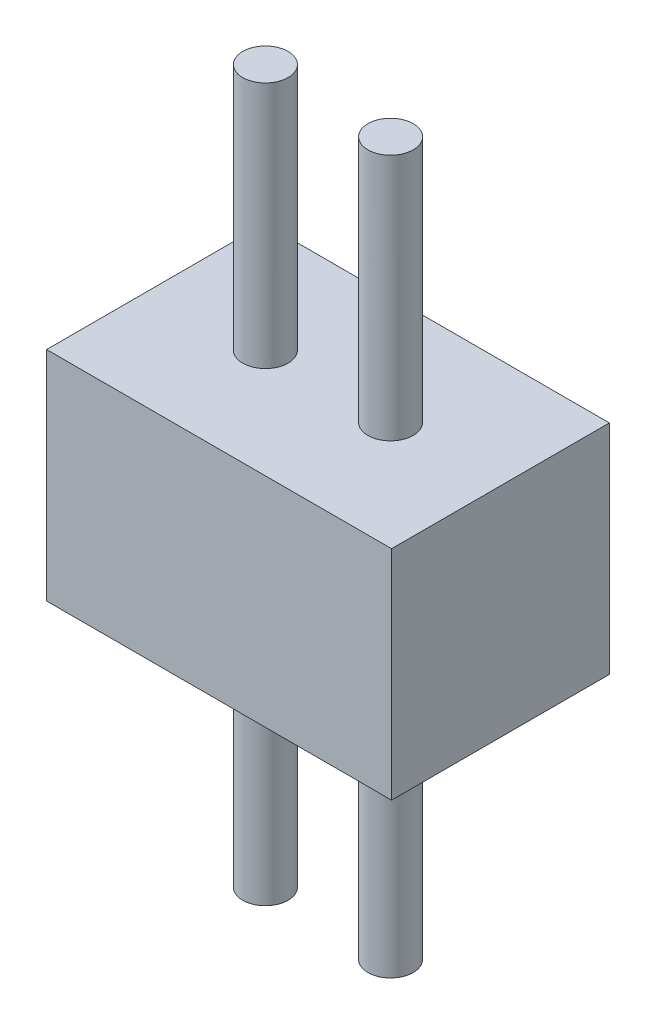
ISO-10303-21;
HEADER;
FILE_DESCRIPTION(('STEP AP214'),'2;1');
FILE_NAME('part.step','',(''),(''),'','','');
FILE_SCHEMA(('AUTOMOTIVE_DESIGN { 1 0 10303 214 1 1 1 1 }'));
ENDSEC;
DATA;
#1=APPLICATION_CONTEXT('core data for automotive mechanical design processes');
#2=APPLICATION_PROTOCOL_DEFINITION('international standard','automotive_design',2000,#1);
#3=PRODUCT_CONTEXT('',#1,'mechanical');
#4=PRODUCT('Part','Part','',(#3));
#5=PRODUCT_RELATED_PRODUCT_CATEGORY('part','',(#4));
#6=PRODUCT_DEFINITION_FORMATION('','',#4);
#7=PRODUCT_DEFINITION_CONTEXT('part definition',#1,'design');
#8=PRODUCT_DEFINITION('design','',#6,#7);
#9=PRODUCT_DEFINITION_SHAPE('','',#8);
#10=(LENGTH_UNIT() NAMED_UNIT(*) SI_UNIT(.MILLI.,.METRE.));
#11=(NAMED_UNIT(*) PLANE_ANGLE_UNIT() SI_UNIT($,.RADIAN.));
#12=(NAMED_UNIT(*) SI_UNIT($,.STERADIAN.) SOLID_ANGLE_UNIT());
#13=UNCERTAINTY_MEASURE_WITH_UNIT(LENGTH_MEASURE(1.E-05),#10,'distance_accuracy_value','');
#14=(GEOMETRIC_REPRESENTATION_CONTEXT(3) GLOBAL_UNCERTAINTY_ASSIGNED_CONTEXT((#13)) GLOBAL_UNIT_ASSIGNED_CONTEXT((#10,
#11,#12)) REPRESENTATION_CONTEXT('',''));
#15=CARTESIAN_POINT('',(0.,0.,0.));
#16=DIRECTION('',(0.,0.,1.));
#17=DIRECTION('',(1.,0.,0.));
#18=AXIS2_PLACEMENT_3D('',#15,#16,#17);
#19=CARTESIAN_POINT('',(0.,2.21,0.));
#20=DIRECTION('',(1.,0.,0.));
#21=DIRECTION('',(0.,0.,-1.));
#22=AXIS2_PLACEMENT_3D('',#19,#20,#21);
#23=PLANE('',#22);
#24=DIRECTION('',(0.,0.,1.));
#25=VECTOR('',#24,1.);
#26=CARTESIAN_POINT('',(0.,0.,0.));
#27=LINE('',#26,#25);
#28=CARTESIAN_POINT('',(0.,0.,-2.21));
#29=VERTEX_POINT('',#28);
#30=CARTESIAN_POINT('',(0.,0.,0.));
#31=VERTEX_POINT('',#30);
#32=EDGE_CURVE('E100',#29,#31,#27,.T.);
#33=ORIENTED_EDGE('',*,*,#32,.T.);
#34=DIRECTION('',(0.,-1.,0.));
#35=VECTOR('',#34,1.);
#36=CARTESIAN_POINT('',(0.,2.21,0.));
#37=LINE('',#36,#35);
#38=CARTESIAN_POINT('',(0.,2.21,0.));
#39=VERTEX_POINT('',#38);
#40=EDGE_CURVE('E91',#39,#31,#37,.T.);
#41=ORIENTED_EDGE('',*,*,#40,.F.);
#42=DIRECTION('',(0.,0.,1.));
#43=VECTOR('',#42,1.);
#44=CARTESIAN_POINT('',(0.,2.21,0.));
#45=LINE('',#44,#43);
#46=CARTESIAN_POINT('',(0.,2.21,-2.21));
#47=VERTEX_POINT('',#46);
#48=EDGE_CURVE('E85',#47,#39,#45,.T.);
#49=ORIENTED_EDGE('',*,*,#48,.F.);
#50=DIRECTION('',(0.,-1.,0.));
#51=VECTOR('',#50,1.);
#52=CARTESIAN_POINT('',(0.,2.21,-2.21));
#53=LINE('',#52,#51);
#54=EDGE_CURVE('E96',#47,#29,#53,.T.);
#55=ORIENTED_EDGE('',*,*,#54,.T.);
#56=EDGE_LOOP('',(#33,#41,#49,#55));
#57=FACE_BOUND('',#56,.T.);
#58=ADVANCED_FACE('F33',(#57),#23,.F.);
#59=CARTESIAN_POINT('',(0.,2.21,0.));
#60=DIRECTION('',(0.,0.,-1.));
#61=DIRECTION('',(-1.,0.,0.));
#62=AXIS2_PLACEMENT_3D('',#59,#60,#61);
#63=PLANE('',#62);
#64=DIRECTION('',(1.,0.,0.));
#65=VECTOR('',#64,1.);
#66=CARTESIAN_POINT('',(0.,0.,0.));
#67=LINE('',#66,#65);
#68=CARTESIAN_POINT('',(3.5,0.,0.));
#69=VERTEX_POINT('',#68);
#70=EDGE_CURVE('E90',#31,#69,#67,.T.);
#71=ORIENTED_EDGE('',*,*,#70,.T.);
#72=DIRECTION('',(0.,-1.,0.));
#73=VECTOR('',#72,1.);
#74=CARTESIAN_POINT('',(3.5,2.21,0.));
#75=LINE('',#74,#73);
#76=CARTESIAN_POINT('',(3.5,2.21,0.));
#77=VERTEX_POINT('',#76);
#78=EDGE_CURVE('E88',#77,#69,#75,.T.);
#79=ORIENTED_EDGE('',*,*,#78,.F.);
#80=DIRECTION('',(1.,0.,0.));
#81=VECTOR('',#80,1.);
#82=CARTESIAN_POINT('',(0.,2.21,0.));
#83=LINE('',#82,#81);
#84=EDGE_CURVE('E80',#39,#77,#83,.T.);
#85=ORIENTED_EDGE('',*,*,#84,.F.);
#86=ORIENTED_EDGE('',*,*,#40,.T.);
#87=EDGE_LOOP('',(#71,#79,#85,#86));
#88=FACE_BOUND('',#87,.T.);
#89=ADVANCED_FACE('F89',(#88),#63,.F.);
#90=CARTESIAN_POINT('',(3.5,2.21,0.));
#91=DIRECTION('',(-1.,0.,0.));
#92=DIRECTION('',(0.,0.,1.));
#93=AXIS2_PLACEMENT_3D('',#90,#91,#92);
#94=PLANE('',#93);
#95=DIRECTION('',(0.,0.,-1.));
#96=VECTOR('',#95,1.);
#97=CARTESIAN_POINT('',(3.5,0.,0.));
#98=LINE('',#97,#96);
#99=CARTESIAN_POINT('',(3.5,0.,-2.21));
#100=VERTEX_POINT('',#99);
#101=EDGE_CURVE('E66',#69,#100,#98,.T.);
#102=ORIENTED_EDGE('',*,*,#101,.T.);
#103=DIRECTION('',(0.,-1.,0.));
#104=VECTOR('',#103,1.);
#105=CARTESIAN_POINT('',(3.5,2.21,-2.21));
#106=LINE('',#105,#104);
#107=CARTESIAN_POINT('',(3.5,2.21,-2.21));
#108=VERTEX_POINT('',#107);
#109=EDGE_CURVE('E92',#108,#100,#106,.T.);
#110=ORIENTED_EDGE('',*,*,#109,.F.);
#111=DIRECTION('',(0.,0.,-1.));
#112=VECTOR('',#111,1.);
#113=CARTESIAN_POINT('',(3.5,2.21,0.));
#114=LINE('',#113,#112);
#115=EDGE_CURVE('E83',#77,#108,#114,.T.);
#116=ORIENTED_EDGE('',*,*,#115,.F.);
#117=ORIENTED_EDGE('',*,*,#78,.T.);
#118=EDGE_LOOP('',(#102,#110,#116,#117));
#119=FACE_BOUND('',#118,.T.);
#120=ADVANCED_FACE('F94',(#119),#94,.F.);
#121=CARTESIAN_POINT('',(0.,2.21,-2.21));
#122=DIRECTION('',(0.,0.,1.));
#123=DIRECTION('',(1.,0.,0.));
#124=AXIS2_PLACEMENT_3D('',#121,#122,#123);
#125=PLANE('',#124);
#126=DIRECTION('',(-1.,0.,0.));
#127=VECTOR('',#126,1.);
#128=CARTESIAN_POINT('',(0.,0.,-2.21));
#129=LINE('',#128,#127);
#130=EDGE_CURVE('E72',#100,#29,#129,.T.);
#131=ORIENTED_EDGE('',*,*,#130,.T.);
#132=ORIENTED_EDGE('',*,*,#54,.F.);
#133=DIRECTION('',(-1.,0.,0.));
#134=VECTOR('',#133,1.);
#135=CARTESIAN_POINT('',(0.,2.21,-2.21));
#136=LINE('',#135,#134);
#137=EDGE_CURVE('E49',#108,#47,#136,.T.);
#138=ORIENTED_EDGE('',*,*,#137,.F.);
#139=ORIENTED_EDGE('',*,*,#109,.T.);
#140=EDGE_LOOP('',(#131,#132,#138,#139));
#141=FACE_BOUND('',#140,.T.);
#142=ADVANCED_FACE('F116',(#141),#125,.F.);
#143=CARTESIAN_POINT('',(0.,2.21,0.));
#144=DIRECTION('',(0.,-1.,0.));
#145=DIRECTION('',(0.,0.,-1.));
#146=AXIS2_PLACEMENT_3D('',#143,#144,#145);
#147=PLANE('',#146);
#148=CARTESIAN_POINT('',(1.115,2.21,-1.105));
#149=DIRECTION('',(0.,-1.,0.));
#150=DIRECTION('',(0.,0.,-1.));
#151=AXIS2_PLACEMENT_3D('',#148,#149,#150);
#152=CIRCLE('',#151,0.23);
#153=CARTESIAN_POINT('',(1.115,2.21,-1.335));
#154=VERTEX_POINT('',#153);
#155=EDGE_CURVE('E11',#154,#154,#152,.F.);
#156=ORIENTED_EDGE('',*,*,#155,.F.);
#157=EDGE_LOOP('',(#156));
#158=FACE_BOUND('',#157,.T.);
#159=CARTESIAN_POINT('',(2.385,2.21,-1.105));
#160=DIRECTION('',(0.,-1.,0.));
#161=DIRECTION('',(0.,0.,-1.));
#162=AXIS2_PLACEMENT_3D('',#159,#160,#161);
#163=CIRCLE('',#162,0.23);
#164=CARTESIAN_POINT('',(2.385,2.21,-1.335));
#165=VERTEX_POINT('',#164);
#166=EDGE_CURVE('E41',#165,#165,#163,.F.);
#167=ORIENTED_EDGE('',*,*,#166,.F.);
#168=EDGE_LOOP('',(#167));
#169=FACE_BOUND('',#168,.T.);
#170=ORIENTED_EDGE('',*,*,#48,.T.);
#171=ORIENTED_EDGE('',*,*,#84,.T.);
#172=ORIENTED_EDGE('',*,*,#115,.T.);
#173=ORIENTED_EDGE('',*,*,#137,.T.);
#174=EDGE_LOOP('',(#170,#171,#172,#173));
#175=FACE_BOUND('',#174,.T.);
#176=ADVANCED_FACE('F81',(#158,#169,#175),#147,.F.);
#177=CARTESIAN_POINT('',(0.,0.,0.));
#178=DIRECTION('',(0.,-1.,0.));
#179=DIRECTION('',(0.,0.,-1.));
#180=AXIS2_PLACEMENT_3D('',#177,#178,#179);
#181=PLANE('',#180);
#182=CARTESIAN_POINT('',(2.385,0.,-1.105));
#183=DIRECTION('',(0.,-1.,0.));
#184=DIRECTION('',(0.,0.,-1.));
#185=AXIS2_PLACEMENT_3D('',#182,#183,#184);
#186=CIRCLE('',#185,0.23);
#187=CARTESIAN_POINT('',(2.385,0.,-1.335));
#188=VERTEX_POINT('',#187);
#189=EDGE_CURVE('E143',#188,#188,#186,.T.);
#190=ORIENTED_EDGE('',*,*,#189,.F.);
#191=EDGE_LOOP('',(#190));
#192=FACE_BOUND('',#191,.T.);
#193=CARTESIAN_POINT('',(1.115,0.,-1.105));
#194=DIRECTION('',(0.,-1.,0.));
#195=DIRECTION('',(0.,0.,-1.));
#196=AXIS2_PLACEMENT_3D('',#193,#194,#195);
#197=CIRCLE('',#196,0.23);
#198=CARTESIAN_POINT('',(1.115,0.,-1.335));
#199=VERTEX_POINT('',#198);
#200=EDGE_CURVE('E137',#199,#199,#197,.T.);
#201=ORIENTED_EDGE('',*,*,#200,.F.);
#202=EDGE_LOOP('',(#201));
#203=FACE_BOUND('',#202,.T.);
#204=ORIENTED_EDGE('',*,*,#32,.F.);
#205=ORIENTED_EDGE('',*,*,#130,.F.);
#206=ORIENTED_EDGE('',*,*,#101,.F.);
#207=ORIENTED_EDGE('',*,*,#70,.F.);
#208=EDGE_LOOP('',(#204,#205,#206,#207));
#209=FACE_BOUND('',#208,.T.);
#210=ADVANCED_FACE('F115',(#192,#203,#209),#181,.T.);
#211=CARTESIAN_POINT('',(1.115,-2.51,-1.105));
#212=DIRECTION('',(0.,1.,0.));
#213=DIRECTION('',(0.,0.,1.));
#214=AXIS2_PLACEMENT_3D('',#211,#212,#213);
#215=CYLINDRICAL_SURFACE('',#214,0.23);
#216=CARTESIAN_POINT('',(1.115,-2.51,-1.105));
#217=DIRECTION('',(0.,-1.,0.));
#218=DIRECTION('',(0.,0.,-1.));
#219=AXIS2_PLACEMENT_3D('',#216,#217,#218);
#220=CIRCLE('',#219,0.23);
#221=CARTESIAN_POINT('',(1.115,-2.51,-1.335));
#222=VERTEX_POINT('',#221);
#223=EDGE_CURVE('E103',#222,#222,#220,.T.);
#224=ORIENTED_EDGE('',*,*,#223,.F.);
#225=EDGE_LOOP('',(#224));
#226=FACE_BOUND('',#225,.T.);
#227=ORIENTED_EDGE('',*,*,#200,.T.);
#228=EDGE_LOOP('',(#227));
#229=FACE_BOUND('',#228,.T.);
#230=ADVANCED_FACE('F123',(#226,#229),#215,.T.);
#231=CARTESIAN_POINT('',(1.115,-2.51,-1.105));
#232=DIRECTION('',(0.,-1.,0.));
#233=DIRECTION('',(0.,0.,-1.));
#234=AXIS2_PLACEMENT_3D('',#231,#232,#233);
#235=PLANE('',#234);
#236=ORIENTED_EDGE('',*,*,#223,.T.);
#237=EDGE_LOOP('',(#236));
#238=FACE_BOUND('',#237,.T.);
#239=ADVANCED_FACE('F180',(#238),#235,.T.);
#240=CARTESIAN_POINT('',(2.385,-2.51,-1.105));
#241=DIRECTION('',(0.,1.,0.));
#242=DIRECTION('',(0.,0.,1.));
#243=AXIS2_PLACEMENT_3D('',#240,#241,#242);
#244=CYLINDRICAL_SURFACE('',#243,0.23);
#245=CARTESIAN_POINT('',(2.385,-2.51,-1.105));
#246=DIRECTION('',(0.,-1.,0.));
#247=DIRECTION('',(0.,0.,-1.));
#248=AXIS2_PLACEMENT_3D('',#245,#246,#247);
#249=CIRCLE('',#248,0.23);
#250=CARTESIAN_POINT('',(2.385,-2.51,-1.335));
#251=VERTEX_POINT('',#250);
#252=EDGE_CURVE('E140',#251,#251,#249,.T.);
#253=ORIENTED_EDGE('',*,*,#252,.F.);
#254=EDGE_LOOP('',(#253));
#255=FACE_BOUND('',#254,.T.);
#256=ORIENTED_EDGE('',*,*,#189,.T.);
#257=EDGE_LOOP('',(#256));
#258=FACE_BOUND('',#257,.T.);
#259=ADVANCED_FACE('F176',(#255,#258),#244,.T.);
#260=CARTESIAN_POINT('',(2.385,-2.51,-1.105));
#261=DIRECTION('',(0.,-1.,0.));
#262=DIRECTION('',(0.,0.,-1.));
#263=AXIS2_PLACEMENT_3D('',#260,#261,#262);
#264=PLANE('',#263);
#265=ORIENTED_EDGE('',*,*,#252,.T.);
#266=EDGE_LOOP('',(#265));
#267=FACE_BOUND('',#266,.T.);
#268=ADVANCED_FACE('F172',(#267),#264,.T.);
#269=CARTESIAN_POINT('',(2.385,4.72,-1.105));
#270=DIRECTION('',(0.,-1.,0.));
#271=DIRECTION('',(0.,0.,-1.));
#272=AXIS2_PLACEMENT_3D('',#269,#270,#271);
#273=CYLINDRICAL_SURFACE('',#272,0.23);
#274=CARTESIAN_POINT('',(2.385,4.72,-1.105));
#275=DIRECTION('',(0.,1.,0.));
#276=DIRECTION('',(0.,0.,1.));
#277=AXIS2_PLACEMENT_3D('',#274,#275,#276);
#278=CIRCLE('',#277,0.23);
#279=CARTESIAN_POINT('',(2.385,4.72,-0.875));
#280=VERTEX_POINT('',#279);
#281=EDGE_CURVE('E146',#280,#280,#278,.T.);
#282=ORIENTED_EDGE('',*,*,#281,.F.);
#283=EDGE_LOOP('',(#282));
#284=FACE_BOUND('',#283,.T.);
#285=ORIENTED_EDGE('',*,*,#166,.T.);
#286=EDGE_LOOP('',(#285));
#287=FACE_BOUND('',#286,.T.);
#288=ADVANCED_FACE('F112',(#284,#287),#273,.T.);
#289=CARTESIAN_POINT('',(2.385,4.72,-1.105));
#290=DIRECTION('',(0.,1.,0.));
#291=DIRECTION('',(0.,0.,1.));
#292=AXIS2_PLACEMENT_3D('',#289,#290,#291);
#293=PLANE('',#292);
#294=ORIENTED_EDGE('',*,*,#281,.T.);
#295=EDGE_LOOP('',(#294));
#296=FACE_BOUND('',#295,.T.);
#297=ADVANCED_FACE('F160',(#296),#293,.T.);
#298=CARTESIAN_POINT('',(1.115,4.72,-1.105));
#299=DIRECTION('',(0.,-1.,0.));
#300=DIRECTION('',(0.,0.,-1.));
#301=AXIS2_PLACEMENT_3D('',#298,#299,#300);
#302=CYLINDRICAL_SURFACE('',#301,0.23);
#303=CARTESIAN_POINT('',(1.115,4.72,-1.105));
#304=DIRECTION('',(0.,1.,0.));
#305=DIRECTION('',(0.,0.,1.));
#306=AXIS2_PLACEMENT_3D('',#303,#304,#305);
#307=CIRCLE('',#306,0.23);
#308=CARTESIAN_POINT('',(1.115,4.72,-0.875));
#309=VERTEX_POINT('',#308);
#310=EDGE_CURVE('E151',#309,#309,#307,.T.);
#311=ORIENTED_EDGE('',*,*,#310,.F.);
#312=EDGE_LOOP('',(#311));
#313=FACE_BOUND('',#312,.T.);
#314=ORIENTED_EDGE('',*,*,#155,.T.);
#315=EDGE_LOOP('',(#314));
#316=FACE_BOUND('',#315,.T.);
#317=ADVANCED_FACE('F157',(#313,#316),#302,.T.);
#318=CARTESIAN_POINT('',(1.115,4.72,-1.105));
#319=DIRECTION('',(0.,1.,0.));
#320=DIRECTION('',(0.,0.,1.));
#321=AXIS2_PLACEMENT_3D('',#318,#319,#320);
#322=PLANE('',#321);
#323=ORIENTED_EDGE('',*,*,#310,.T.);
#324=EDGE_LOOP('',(#323));
#325=FACE_BOUND('',#324,.T.);
#326=ADVANCED_FACE('F155',(#325),#322,.T.);
#327=CLOSED_SHELL('',(#58,#89,#120,#142,#176,#210,#230,#239,#259,#268,#288,#297,#317,#326));
#328=MANIFOLD_SOLID_BREP('B2',#327);
#329=ADVANCED_BREP_SHAPE_REPRESENTATION('',(#18,#328),#14);
#330=SHAPE_DEFINITION_REPRESENTATION(#9,#329);
ENDSEC;
END-ISO-10303-21;
